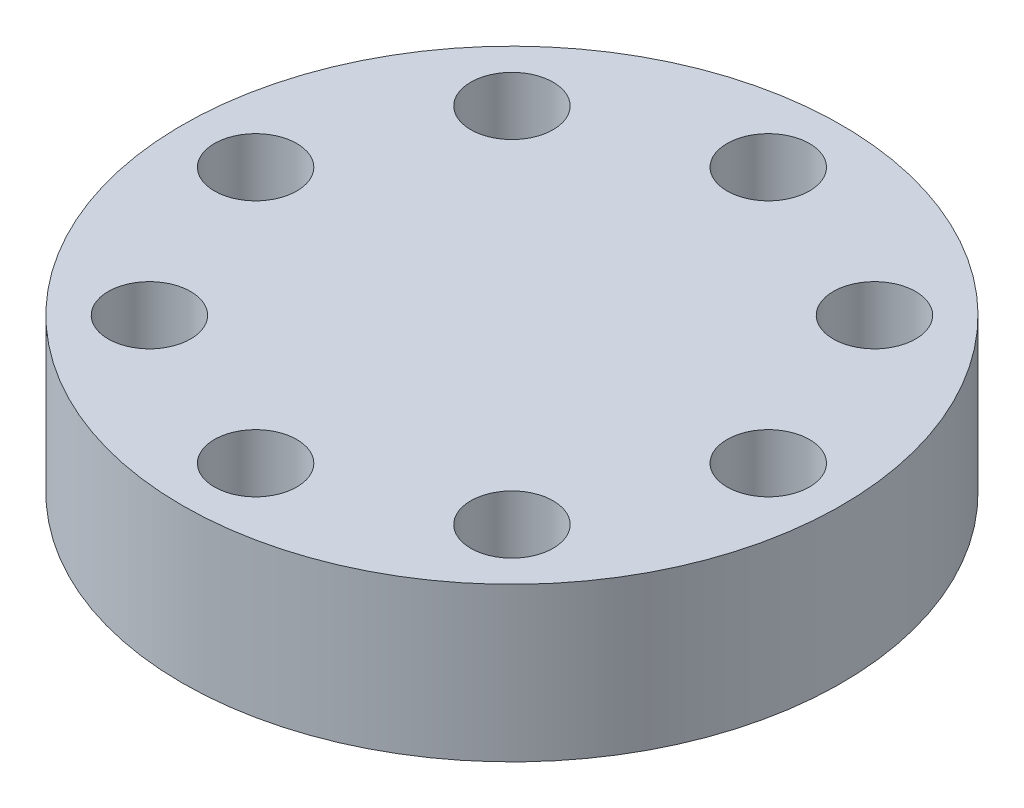
ISO-10303-21;
HEADER;
FILE_DESCRIPTION(('STEP AP214'),'2;1');
FILE_NAME('part.step','',(''),(''),'','','');
FILE_SCHEMA(('AUTOMOTIVE_DESIGN { 1 0 10303 214 1 1 1 1 }'));
ENDSEC;
DATA;
#1=APPLICATION_CONTEXT('core data for automotive mechanical design processes');
#2=APPLICATION_PROTOCOL_DEFINITION('international standard','automotive_design',2000,#1);
#3=PRODUCT_CONTEXT('',#1,'mechanical');
#4=PRODUCT('Part','Part','',(#3));
#5=PRODUCT_RELATED_PRODUCT_CATEGORY('part','',(#4));
#6=PRODUCT_DEFINITION_FORMATION('','',#4);
#7=PRODUCT_DEFINITION_CONTEXT('part definition',#1,'design');
#8=PRODUCT_DEFINITION('design','',#6,#7);
#9=PRODUCT_DEFINITION_SHAPE('','',#8);
#10=(LENGTH_UNIT() NAMED_UNIT(*) SI_UNIT(.MILLI.,.METRE.));
#11=(NAMED_UNIT(*) PLANE_ANGLE_UNIT() SI_UNIT($,.RADIAN.));
#12=(NAMED_UNIT(*) SI_UNIT($,.STERADIAN.) SOLID_ANGLE_UNIT());
#13=UNCERTAINTY_MEASURE_WITH_UNIT(LENGTH_MEASURE(1.E-05),#10,'distance_accuracy_value','');
#14=(GEOMETRIC_REPRESENTATION_CONTEXT(3) GLOBAL_UNCERTAINTY_ASSIGNED_CONTEXT((#13)) GLOBAL_UNIT_ASSIGNED_CONTEXT((#10,
#11,#12)) REPRESENTATION_CONTEXT('',''));
#15=CARTESIAN_POINT('',(0.,0.,0.));
#16=DIRECTION('',(0.,0.,1.));
#17=DIRECTION('',(1.,0.,0.));
#18=AXIS2_PLACEMENT_3D('',#15,#16,#17);
#19=CARTESIAN_POINT('',(0.,4.2,0.));
#20=DIRECTION('',(0.,-1.,0.));
#21=DIRECTION('',(0.,0.,-1.));
#22=AXIS2_PLACEMENT_3D('',#19,#20,#21);
#23=CYLINDRICAL_SURFACE('',#22,9.);
#24=CARTESIAN_POINT('',(0.,4.2,0.));
#25=DIRECTION('',(0.,1.,0.));
#26=DIRECTION('',(0.,0.,1.));
#27=AXIS2_PLACEMENT_3D('',#24,#25,#26);
#28=CIRCLE('',#27,9.);
#29=CARTESIAN_POINT('',(0.,4.2,9.));
#30=VERTEX_POINT('',#29);
#31=EDGE_CURVE('E10',#30,#30,#28,.T.);
#32=ORIENTED_EDGE('',*,*,#31,.F.);
#33=EDGE_LOOP('',(#32));
#34=FACE_BOUND('',#33,.T.);
#35=CARTESIAN_POINT('',(0.,0.,0.));
#36=DIRECTION('',(0.,1.,0.));
#37=DIRECTION('',(0.,0.,1.));
#38=AXIS2_PLACEMENT_3D('',#35,#36,#37);
#39=CIRCLE('',#38,9.);
#40=CARTESIAN_POINT('',(0.,0.,9.));
#41=VERTEX_POINT('',#40);
#42=EDGE_CURVE('E34',#41,#41,#39,.T.);
#43=ORIENTED_EDGE('',*,*,#42,.T.);
#44=EDGE_LOOP('',(#43));
#45=FACE_BOUND('',#44,.T.);
#46=ADVANCED_FACE('F31',(#34,#45),#23,.T.);
#47=CARTESIAN_POINT('',(0.,4.2,0.));
#48=DIRECTION('',(0.,1.,0.));
#49=DIRECTION('',(0.,0.,1.));
#50=AXIS2_PLACEMENT_3D('',#47,#48,#49);
#51=PLANE('',#50);
#52=CARTESIAN_POINT('',(-4.94974746830566,4.2,-4.94974746830541));
#53=DIRECTION('',(0.,1.,0.));
#54=DIRECTION('',(0.,0.,1.));
#55=AXIS2_PLACEMENT_3D('',#52,#53,#54);
#56=CIRCLE('',#55,1.12500000000037);
#57=CARTESIAN_POINT('',(-4.94974746830566,4.2,-3.82474746830504));
#58=VERTEX_POINT('',#57);
#59=EDGE_CURVE('E53',#58,#58,#56,.T.);
#60=ORIENTED_EDGE('',*,*,#59,.F.);
#61=EDGE_LOOP('',(#60));
#62=FACE_BOUND('',#61,.T.);
#63=CARTESIAN_POINT('',(-6.9999999999994,4.2,5.96855898038484E-13));
#64=DIRECTION('',(0.,1.,0.));
#65=DIRECTION('',(0.,0.,1.));
#66=AXIS2_PLACEMENT_3D('',#63,#64,#65);
#67=CIRCLE('',#66,1.12500000000082);
#68=CARTESIAN_POINT('',(-6.9999999999994,4.2,1.12500000000141));
#69=VERTEX_POINT('',#68);
#70=EDGE_CURVE('E52',#69,#69,#67,.T.);
#71=ORIENTED_EDGE('',*,*,#70,.F.);
#72=EDGE_LOOP('',(#71));
#73=FACE_BOUND('',#72,.T.);
#74=CARTESIAN_POINT('',(-4.94974746830482,4.2,4.94974746830626));
#75=DIRECTION('',(0.,1.,0.));
#76=DIRECTION('',(0.,0.,1.));
#77=AXIS2_PLACEMENT_3D('',#74,#75,#76);
#78=CIRCLE('',#77,1.12500000000116);
#79=CARTESIAN_POINT('',(-4.94974746830482,4.2,6.07474746830741));
#80=VERTEX_POINT('',#79);
#81=EDGE_CURVE('E60',#80,#80,#78,.T.);
#82=ORIENTED_EDGE('',*,*,#81,.F.);
#83=EDGE_LOOP('',(#82));
#84=FACE_BOUND('',#83,.T.);
#85=CARTESIAN_POINT('',(1.19199729055816E-12,4.2,7.));
#86=DIRECTION('',(0.,1.,0.));
#87=DIRECTION('',(0.,0.,1.));
#88=AXIS2_PLACEMENT_3D('',#85,#86,#87);
#89=CIRCLE('',#88,1.12500000000119);
#90=CARTESIAN_POINT('',(1.19199729055816E-12,4.2,8.12500000000119));
#91=VERTEX_POINT('',#90);
#92=EDGE_CURVE('E66',#91,#91,#89,.T.);
#93=ORIENTED_EDGE('',*,*,#92,.F.);
#94=EDGE_LOOP('',(#93));
#95=FACE_BOUND('',#94,.T.);
#96=CARTESIAN_POINT('',(4.94974746830685,4.2,4.94974746830541));
#97=DIRECTION('',(0.,1.,0.));
#98=DIRECTION('',(0.,0.,1.));
#99=AXIS2_PLACEMENT_3D('',#96,#97,#98);
#100=CIRCLE('',#99,1.12500000000088);
#101=CARTESIAN_POINT('',(4.94974746830685,4.2,6.07474746830629));
#102=VERTEX_POINT('',#101);
#103=EDGE_CURVE('E72',#102,#102,#100,.T.);
#104=ORIENTED_EDGE('',*,*,#103,.F.);
#105=EDGE_LOOP('',(#104));
#106=FACE_BOUND('',#105,.T.);
#107=CARTESIAN_POINT('',(7.0000000000006,4.2,-5.95998645279081E-13));
#108=DIRECTION('',(0.,1.,0.));
#109=DIRECTION('',(0.,0.,1.));
#110=AXIS2_PLACEMENT_3D('',#107,#108,#109);
#111=CIRCLE('',#110,1.12500000000042);
#112=CARTESIAN_POINT('',(7.0000000000006,4.2,1.12499999999982));
#113=VERTEX_POINT('',#112);
#114=EDGE_CURVE('E78',#113,#113,#111,.T.);
#115=ORIENTED_EDGE('',*,*,#114,.F.);
#116=EDGE_LOOP('',(#115));
#117=FACE_BOUND('',#116,.T.);
#118=CARTESIAN_POINT('',(4.94974746830601,4.2,-4.94974746830625));
#119=DIRECTION('',(0.,1.,0.));
#120=DIRECTION('',(0.,0.,1.));
#121=AXIS2_PLACEMENT_3D('',#118,#119,#120);
#122=CIRCLE('',#121,1.12500000000006);
#123=CARTESIAN_POINT('',(4.94974746830601,4.2,-3.8247474683062));
#124=VERTEX_POINT('',#123);
#125=EDGE_CURVE('E84',#124,#124,#122,.T.);
#126=ORIENTED_EDGE('',*,*,#125,.F.);
#127=EDGE_LOOP('',(#126));
#128=FACE_BOUND('',#127,.T.);
#129=CARTESIAN_POINT('',(0.,4.2,-7.));
#130=DIRECTION('',(0.,1.,0.));
#131=DIRECTION('',(0.,0.,1.));
#132=AXIS2_PLACEMENT_3D('',#129,#130,#131);
#133=CIRCLE('',#132,1.125);
#134=CARTESIAN_POINT('',(0.,4.2,-5.875));
#135=VERTEX_POINT('',#134);
#136=EDGE_CURVE('E45',#135,#135,#133,.T.);
#137=ORIENTED_EDGE('',*,*,#136,.F.);
#138=EDGE_LOOP('',(#137));
#139=FACE_BOUND('',#138,.T.);
#140=ORIENTED_EDGE('',*,*,#31,.T.);
#141=EDGE_LOOP('',(#140));
#142=FACE_BOUND('',#141,.T.);
#143=ADVANCED_FACE('F110',(#62,#73,#84,#95,#106,#117,#128,#139,#142),#51,.T.);
#144=CARTESIAN_POINT('',(0.,0.,0.));
#145=DIRECTION('',(0.,1.,0.));
#146=DIRECTION('',(0.,0.,1.));
#147=AXIS2_PLACEMENT_3D('',#144,#145,#146);
#148=PLANE('',#147);
#149=CARTESIAN_POINT('',(0.,0.,0.));
#150=DIRECTION('',(0.,-1.,0.));
#151=DIRECTION('',(0.,0.,-1.));
#152=AXIS2_PLACEMENT_3D('',#149,#150,#151);
#153=CIRCLE('',#152,3.);
#154=CARTESIAN_POINT('',(0.,0.,-3.));
#155=VERTEX_POINT('',#154);
#156=EDGE_CURVE('E91',#155,#155,#153,.T.);
#157=ORIENTED_EDGE('',*,*,#156,.F.);
#158=EDGE_LOOP('',(#157));
#159=FACE_BOUND('',#158,.T.);
#160=CARTESIAN_POINT('',(-4.94974746830566,0.,-4.94974746830541));
#161=DIRECTION('',(0.,1.,0.));
#162=DIRECTION('',(0.,0.,1.));
#163=AXIS2_PLACEMENT_3D('',#160,#161,#162);
#164=CIRCLE('',#163,1.12500000000037);
#165=CARTESIAN_POINT('',(-4.94974746830566,0.,-3.82474746830504));
#166=VERTEX_POINT('',#165);
#167=EDGE_CURVE('E49',#166,#166,#164,.F.);
#168=ORIENTED_EDGE('',*,*,#167,.F.);
#169=EDGE_LOOP('',(#168));
#170=FACE_BOUND('',#169,.T.);
#171=CARTESIAN_POINT('',(-6.9999999999994,0.,5.96855898038484E-13));
#172=DIRECTION('',(0.,1.,0.));
#173=DIRECTION('',(0.,0.,1.));
#174=AXIS2_PLACEMENT_3D('',#171,#172,#173);
#175=CIRCLE('',#174,1.12500000000082);
#176=CARTESIAN_POINT('',(-6.9999999999994,0.,1.12500000000141));
#177=VERTEX_POINT('',#176);
#178=EDGE_CURVE('E57',#177,#177,#175,.F.);
#179=ORIENTED_EDGE('',*,*,#178,.F.);
#180=EDGE_LOOP('',(#179));
#181=FACE_BOUND('',#180,.T.);
#182=CARTESIAN_POINT('',(-4.94974746830482,0.,4.94974746830626));
#183=DIRECTION('',(0.,1.,0.));
#184=DIRECTION('',(0.,0.,1.));
#185=AXIS2_PLACEMENT_3D('',#182,#183,#184);
#186=CIRCLE('',#185,1.12500000000116);
#187=CARTESIAN_POINT('',(-4.94974746830482,0.,6.07474746830741));
#188=VERTEX_POINT('',#187);
#189=EDGE_CURVE('E63',#188,#188,#186,.F.);
#190=ORIENTED_EDGE('',*,*,#189,.F.);
#191=EDGE_LOOP('',(#190));
#192=FACE_BOUND('',#191,.T.);
#193=CARTESIAN_POINT('',(1.19199729055816E-12,0.,7.));
#194=DIRECTION('',(0.,1.,0.));
#195=DIRECTION('',(0.,0.,1.));
#196=AXIS2_PLACEMENT_3D('',#193,#194,#195);
#197=CIRCLE('',#196,1.12500000000119);
#198=CARTESIAN_POINT('',(1.19199729055816E-12,0.,8.12500000000119));
#199=VERTEX_POINT('',#198);
#200=EDGE_CURVE('E69',#199,#199,#197,.F.);
#201=ORIENTED_EDGE('',*,*,#200,.F.);
#202=EDGE_LOOP('',(#201));
#203=FACE_BOUND('',#202,.T.);
#204=CARTESIAN_POINT('',(4.94974746830685,0.,4.94974746830541));
#205=DIRECTION('',(0.,1.,0.));
#206=DIRECTION('',(0.,0.,1.));
#207=AXIS2_PLACEMENT_3D('',#204,#205,#206);
#208=CIRCLE('',#207,1.12500000000088);
#209=CARTESIAN_POINT('',(4.94974746830685,0.,6.07474746830629));
#210=VERTEX_POINT('',#209);
#211=EDGE_CURVE('E75',#210,#210,#208,.F.);
#212=ORIENTED_EDGE('',*,*,#211,.F.);
#213=EDGE_LOOP('',(#212));
#214=FACE_BOUND('',#213,.T.);
#215=CARTESIAN_POINT('',(7.0000000000006,0.,-5.95998645279081E-13));
#216=DIRECTION('',(0.,1.,0.));
#217=DIRECTION('',(0.,0.,1.));
#218=AXIS2_PLACEMENT_3D('',#215,#216,#217);
#219=CIRCLE('',#218,1.12500000000042);
#220=CARTESIAN_POINT('',(7.0000000000006,0.,1.12499999999982));
#221=VERTEX_POINT('',#220);
#222=EDGE_CURVE('E81',#221,#221,#219,.F.);
#223=ORIENTED_EDGE('',*,*,#222,.F.);
#224=EDGE_LOOP('',(#223));
#225=FACE_BOUND('',#224,.T.);
#226=CARTESIAN_POINT('',(4.94974746830601,0.,-4.94974746830625));
#227=DIRECTION('',(0.,1.,0.));
#228=DIRECTION('',(0.,0.,1.));
#229=AXIS2_PLACEMENT_3D('',#226,#227,#228);
#230=CIRCLE('',#229,1.12500000000006);
#231=CARTESIAN_POINT('',(4.94974746830601,0.,-3.8247474683062));
#232=VERTEX_POINT('',#231);
#233=EDGE_CURVE('E48',#232,#232,#230,.F.);
#234=ORIENTED_EDGE('',*,*,#233,.F.);
#235=EDGE_LOOP('',(#234));
#236=FACE_BOUND('',#235,.T.);
#237=CARTESIAN_POINT('',(0.,0.,-7.));
#238=DIRECTION('',(0.,1.,0.));
#239=DIRECTION('',(0.,0.,1.));
#240=AXIS2_PLACEMENT_3D('',#237,#238,#239);
#241=CIRCLE('',#240,1.125);
#242=CARTESIAN_POINT('',(0.,0.,-5.875));
#243=VERTEX_POINT('',#242);
#244=EDGE_CURVE('E41',#243,#243,#241,.F.);
#245=ORIENTED_EDGE('',*,*,#244,.F.);
#246=EDGE_LOOP('',(#245));
#247=FACE_BOUND('',#246,.T.);
#248=ORIENTED_EDGE('',*,*,#42,.F.);
#249=EDGE_LOOP('',(#248));
#250=FACE_BOUND('',#249,.T.);
#251=ADVANCED_FACE('F106',(#159,#170,#181,#192,#203,#214,#225,#236,#247,#250),#148,.F.);
#252=CARTESIAN_POINT('',(0.,-3.18198051534282,-7.));
#253=DIRECTION('',(0.,1.,0.));
#254=DIRECTION('',(0.,0.,1.));
#255=AXIS2_PLACEMENT_3D('',#252,#253,#254);
#256=CYLINDRICAL_SURFACE('',#255,1.125);
#257=ORIENTED_EDGE('',*,*,#244,.T.);
#258=EDGE_LOOP('',(#257));
#259=FACE_BOUND('',#258,.T.);
#260=ORIENTED_EDGE('',*,*,#136,.T.);
#261=EDGE_LOOP('',(#260));
#262=FACE_BOUND('',#261,.T.);
#263=ADVANCED_FACE('F109',(#259,#262),#256,.F.);
#264=CARTESIAN_POINT('',(4.94974746830601,-3.18198051534282,-4.94974746830625));
#265=DIRECTION('',(0.,1.,0.));
#266=DIRECTION('',(0.,0.,1.));
#267=AXIS2_PLACEMENT_3D('',#264,#265,#266);
#268=CYLINDRICAL_SURFACE('',#267,1.12500000000006);
#269=ORIENTED_EDGE('',*,*,#233,.T.);
#270=EDGE_LOOP('',(#269));
#271=FACE_BOUND('',#270,.T.);
#272=ORIENTED_EDGE('',*,*,#125,.T.);
#273=EDGE_LOOP('',(#272));
#274=FACE_BOUND('',#273,.T.);
#275=ADVANCED_FACE('F144',(#271,#274),#268,.F.);
#276=CARTESIAN_POINT('',(7.0000000000006,-3.18198051534282,-5.95998645279081E-13));
#277=DIRECTION('',(0.,1.,0.));
#278=DIRECTION('',(0.,0.,1.));
#279=AXIS2_PLACEMENT_3D('',#276,#277,#278);
#280=CYLINDRICAL_SURFACE('',#279,1.12500000000042);
#281=ORIENTED_EDGE('',*,*,#222,.T.);
#282=EDGE_LOOP('',(#281));
#283=FACE_BOUND('',#282,.T.);
#284=ORIENTED_EDGE('',*,*,#114,.T.);
#285=EDGE_LOOP('',(#284));
#286=FACE_BOUND('',#285,.T.);
#287=ADVANCED_FACE('F164',(#283,#286),#280,.F.);
#288=CARTESIAN_POINT('',(4.94974746830685,-3.18198051534282,4.94974746830541));
#289=DIRECTION('',(0.,1.,0.));
#290=DIRECTION('',(0.,0.,1.));
#291=AXIS2_PLACEMENT_3D('',#288,#289,#290);
#292=CYLINDRICAL_SURFACE('',#291,1.12500000000088);
#293=ORIENTED_EDGE('',*,*,#211,.T.);
#294=EDGE_LOOP('',(#293));
#295=FACE_BOUND('',#294,.T.);
#296=ORIENTED_EDGE('',*,*,#103,.T.);
#297=EDGE_LOOP('',(#296));
#298=FACE_BOUND('',#297,.T.);
#299=ADVANCED_FACE('F160',(#295,#298),#292,.F.);
#300=CARTESIAN_POINT('',(1.19199729055816E-12,-3.18198051534282,7.));
#301=DIRECTION('',(0.,1.,0.));
#302=DIRECTION('',(0.,0.,1.));
#303=AXIS2_PLACEMENT_3D('',#300,#301,#302);
#304=CYLINDRICAL_SURFACE('',#303,1.12500000000119);
#305=ORIENTED_EDGE('',*,*,#200,.T.);
#306=EDGE_LOOP('',(#305));
#307=FACE_BOUND('',#306,.T.);
#308=ORIENTED_EDGE('',*,*,#92,.T.);
#309=EDGE_LOOP('',(#308));
#310=FACE_BOUND('',#309,.T.);
#311=ADVANCED_FACE('F156',(#307,#310),#304,.F.);
#312=CARTESIAN_POINT('',(-4.94974746830482,-3.18198051534282,4.94974746830626));
#313=DIRECTION('',(0.,1.,0.));
#314=DIRECTION('',(0.,0.,1.));
#315=AXIS2_PLACEMENT_3D('',#312,#313,#314);
#316=CYLINDRICAL_SURFACE('',#315,1.12500000000116);
#317=ORIENTED_EDGE('',*,*,#189,.T.);
#318=EDGE_LOOP('',(#317));
#319=FACE_BOUND('',#318,.T.);
#320=ORIENTED_EDGE('',*,*,#81,.T.);
#321=EDGE_LOOP('',(#320));
#322=FACE_BOUND('',#321,.T.);
#323=ADVANCED_FACE('F152',(#319,#322),#316,.F.);
#324=CARTESIAN_POINT('',(-6.9999999999994,-3.18198051534282,5.96855898038484E-13));
#325=DIRECTION('',(0.,1.,0.));
#326=DIRECTION('',(0.,0.,1.));
#327=AXIS2_PLACEMENT_3D('',#324,#325,#326);
#328=CYLINDRICAL_SURFACE('',#327,1.12500000000082);
#329=ORIENTED_EDGE('',*,*,#178,.T.);
#330=EDGE_LOOP('',(#329));
#331=FACE_BOUND('',#330,.T.);
#332=ORIENTED_EDGE('',*,*,#70,.T.);
#333=EDGE_LOOP('',(#332));
#334=FACE_BOUND('',#333,.T.);
#335=ADVANCED_FACE('F148',(#331,#334),#328,.F.);
#336=CARTESIAN_POINT('',(-4.94974746830566,-3.18198051534282,-4.94974746830541));
#337=DIRECTION('',(0.,1.,0.));
#338=DIRECTION('',(0.,0.,1.));
#339=AXIS2_PLACEMENT_3D('',#336,#337,#338);
#340=CYLINDRICAL_SURFACE('',#339,1.12500000000037);
#341=ORIENTED_EDGE('',*,*,#167,.T.);
#342=EDGE_LOOP('',(#341));
#343=FACE_BOUND('',#342,.T.);
#344=ORIENTED_EDGE('',*,*,#59,.T.);
#345=EDGE_LOOP('',(#344));
#346=FACE_BOUND('',#345,.T.);
#347=ADVANCED_FACE('F102',(#343,#346),#340,.F.);
#348=CARTESIAN_POINT('',(0.,3.7,0.));
#349=DIRECTION('',(0.,-1.,0.));
#350=DIRECTION('',(0.,0.,-1.));
#351=AXIS2_PLACEMENT_3D('',#348,#349,#350);
#352=CYLINDRICAL_SURFACE('',#351,3.);
#353=CARTESIAN_POINT('',(0.,3.7,0.));
#354=DIRECTION('',(0.,-1.,0.));
#355=DIRECTION('',(0.,0.,-1.));
#356=AXIS2_PLACEMENT_3D('',#353,#354,#355);
#357=CIRCLE('',#356,3.);
#358=CARTESIAN_POINT('',(0.,3.7,-3.));
#359=VERTEX_POINT('',#358);
#360=EDGE_CURVE('E56',#359,#359,#357,.T.);
#361=ORIENTED_EDGE('',*,*,#360,.F.);
#362=EDGE_LOOP('',(#361));
#363=FACE_BOUND('',#362,.T.);
#364=ORIENTED_EDGE('',*,*,#156,.T.);
#365=EDGE_LOOP('',(#364));
#366=FACE_BOUND('',#365,.T.);
#367=ADVANCED_FACE('F99',(#363,#366),#352,.F.);
#368=CARTESIAN_POINT('',(0.,3.7,0.));
#369=DIRECTION('',(0.,-1.,0.));
#370=DIRECTION('',(0.,0.,-1.));
#371=AXIS2_PLACEMENT_3D('',#368,#369,#370);
#372=PLANE('',#371);
#373=ORIENTED_EDGE('',*,*,#360,.T.);
#374=EDGE_LOOP('',(#373));
#375=FACE_BOUND('',#374,.T.);
#376=ADVANCED_FACE('F97',(#375),#372,.T.);
#377=CLOSED_SHELL('',(#46,#143,#251,#263,#275,#287,#299,#311,#323,#335,#347,#367,#376));
#378=MANIFOLD_SOLID_BREP('B2',#377);
#379=ADVANCED_BREP_SHAPE_REPRESENTATION('',(#18,#378),#14);
#380=SHAPE_DEFINITION_REPRESENTATION(#9,#379);
ENDSEC;
END-ISO-10303-21;
